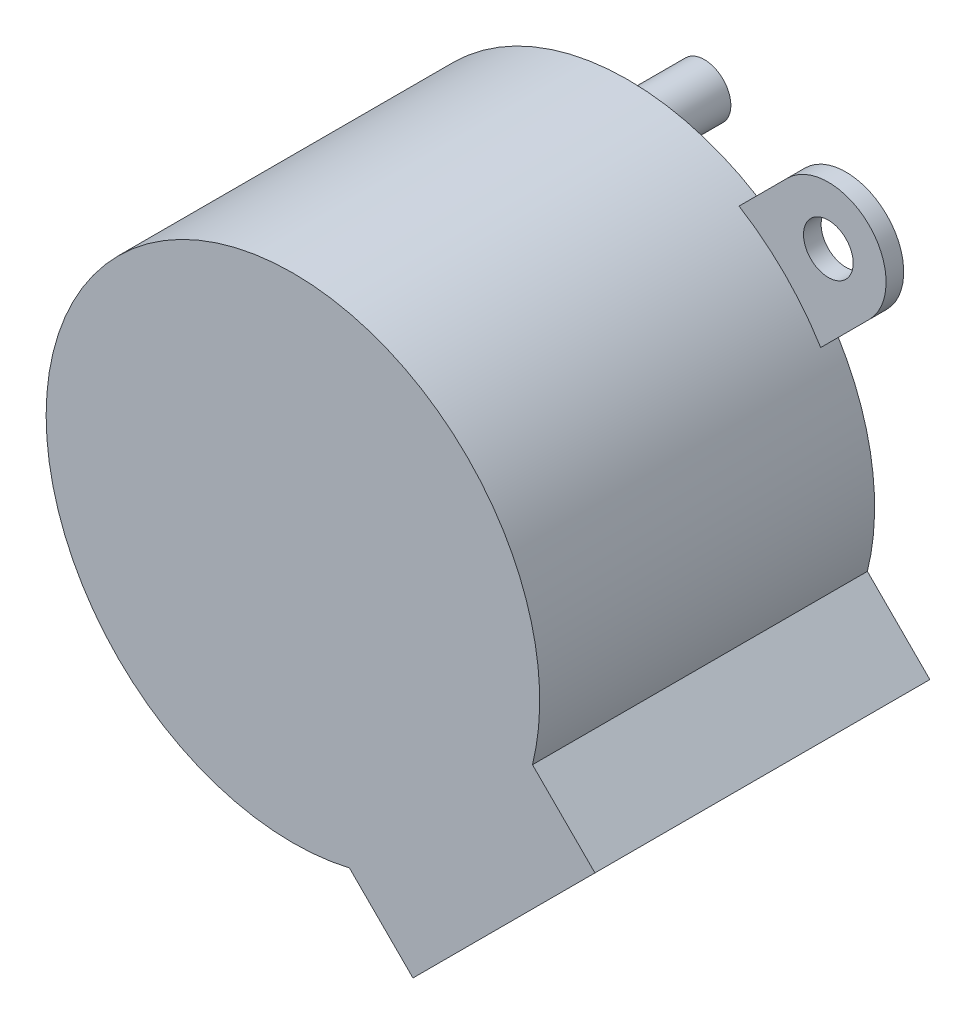
ISO-10303-21;
HEADER;
FILE_DESCRIPTION(('STEP AP214'),'2;1');
FILE_NAME('part.step','',(''),(''),'','','');
FILE_SCHEMA(('AUTOMOTIVE_DESIGN { 1 0 10303 214 1 1 1 1 }'));
ENDSEC;
DATA;
#1=APPLICATION_CONTEXT('core data for automotive mechanical design processes');
#2=APPLICATION_PROTOCOL_DEFINITION('international standard','automotive_design',2000,#1);
#3=PRODUCT_CONTEXT('',#1,'mechanical');
#4=PRODUCT('Part','Part','',(#3));
#5=PRODUCT_RELATED_PRODUCT_CATEGORY('part','',(#4));
#6=PRODUCT_DEFINITION_FORMATION('','',#4);
#7=PRODUCT_DEFINITION_CONTEXT('part definition',#1,'design');
#8=PRODUCT_DEFINITION('design','',#6,#7);
#9=PRODUCT_DEFINITION_SHAPE('','',#8);
#10=(LENGTH_UNIT() NAMED_UNIT(*) SI_UNIT(.MILLI.,.METRE.));
#11=(NAMED_UNIT(*) PLANE_ANGLE_UNIT() SI_UNIT($,.RADIAN.));
#12=(NAMED_UNIT(*) SI_UNIT($,.STERADIAN.) SOLID_ANGLE_UNIT());
#13=UNCERTAINTY_MEASURE_WITH_UNIT(LENGTH_MEASURE(1.E-05),#10,'distance_accuracy_value','');
#14=(GEOMETRIC_REPRESENTATION_CONTEXT(3) GLOBAL_UNCERTAINTY_ASSIGNED_CONTEXT((#13)) GLOBAL_UNIT_ASSIGNED_CONTEXT((#10,
#11,#12)) REPRESENTATION_CONTEXT('',''));
#15=CARTESIAN_POINT('',(0.,0.,0.));
#16=DIRECTION('',(0.,0.,1.));
#17=DIRECTION('',(1.,0.,0.));
#18=AXIS2_PLACEMENT_3D('',#15,#16,#17);
#19=CARTESIAN_POINT('',(39.0000952725,33.1973145386,13.0243098685));
#20=DIRECTION('',(0.,0.,1.));
#21=DIRECTION('',(1.,0.,0.));
#22=AXIS2_PLACEMENT_3D('',#19,#20,#21);
#23=PLANE('',#22);
#24=CARTESIAN_POINT('',(39.0000952725,33.1973145386,13.0243098685));
#25=DIRECTION('',(0.,0.,1.));
#26=DIRECTION('',(1.,0.,0.));
#27=AXIS2_PLACEMENT_3D('',#24,#25,#26);
#28=CIRCLE('',#27,1.5);
#29=CARTESIAN_POINT('',(37.9394351007,34.2579747104,13.0243098685));
#30=VERTEX_POINT('',#29);
#31=CARTESIAN_POINT('',(40.0607554443,32.1366543669,13.0243098685));
#32=VERTEX_POINT('',#31);
#33=EDGE_CURVE('E11',#30,#32,#28,.T.);
#34=ORIENTED_EDGE('',*,*,#33,.F.);
#35=CARTESIAN_POINT('',(39.0000952725,33.1973145386,13.0243098685));
#36=DIRECTION('',(0.,0.,1.));
#37=DIRECTION('',(1.,0.,0.));
#38=AXIS2_PLACEMENT_3D('',#35,#36,#37);
#39=CIRCLE('',#38,1.5);
#40=EDGE_CURVE('E235',#32,#30,#39,.T.);
#41=ORIENTED_EDGE('',*,*,#40,.F.);
#42=EDGE_LOOP('',(#34,#41));
#43=FACE_BOUND('',#42,.T.);
#44=ADVANCED_FACE('F51',(#43),#23,.F.);
#45=CARTESIAN_POINT('',(39.0000952725,33.1973145386,18.0243098685));
#46=DIRECTION('',(0.,0.,1.));
#47=DIRECTION('',(0.707106781186548,-0.707106781186548,0.));
#48=AXIS2_PLACEMENT_3D('',#45,#46,#47);
#49=CYLINDRICAL_SURFACE('',#48,1.5);
#50=DIRECTION('',(0.,0.,1.));
#51=VECTOR('',#50,1.);
#52=CARTESIAN_POINT('',(37.9394351007,34.2579747104,18.0243098685));
#53=LINE('',#52,#51);
#54=CARTESIAN_POINT('',(37.9394351007,34.2579747104,23.0243098685));
#55=VERTEX_POINT('',#54);
#56=EDGE_CURVE('E59',#30,#55,#53,.T.);
#57=ORIENTED_EDGE('',*,*,#56,.F.);
#58=ORIENTED_EDGE('',*,*,#33,.T.);
#59=DIRECTION('',(0.,0.,1.));
#60=VECTOR('',#59,1.);
#61=CARTESIAN_POINT('',(40.0607554443,32.1366543669,18.0243098685));
#62=LINE('',#61,#60);
#63=CARTESIAN_POINT('',(40.0607554443,32.1366543669,23.0243098685));
#64=VERTEX_POINT('',#63);
#65=EDGE_CURVE('E234',#32,#64,#62,.T.);
#66=ORIENTED_EDGE('',*,*,#65,.T.);
#67=CARTESIAN_POINT('',(39.0000952725,33.1973145386,23.0243098685));
#68=DIRECTION('',(0.,0.,1.));
#69=DIRECTION('',(1.,0.,0.));
#70=AXIS2_PLACEMENT_3D('',#67,#68,#69);
#71=CIRCLE('',#70,1.5);
#72=EDGE_CURVE('E251',#55,#64,#71,.T.);
#73=ORIENTED_EDGE('',*,*,#72,.F.);
#74=EDGE_LOOP('',(#57,#58,#66,#73));
#75=FACE_BOUND('',#74,.T.);
#76=ADVANCED_FACE('F255',(#75),#49,.T.);
#77=CARTESIAN_POINT('',(39.0000952725,33.1973145386,18.0243098685));
#78=DIRECTION('',(0.,0.,1.));
#79=DIRECTION('',(0.707106781186548,-0.707106781186548,0.));
#80=AXIS2_PLACEMENT_3D('',#77,#78,#79);
#81=CYLINDRICAL_SURFACE('',#80,1.5);
#82=ORIENTED_EDGE('',*,*,#65,.F.);
#83=ORIENTED_EDGE('',*,*,#40,.T.);
#84=ORIENTED_EDGE('',*,*,#56,.T.);
#85=CARTESIAN_POINT('',(39.0000952725,33.1973145386,23.0243098685));
#86=DIRECTION('',(0.,0.,1.));
#87=DIRECTION('',(1.,0.,0.));
#88=AXIS2_PLACEMENT_3D('',#85,#86,#87);
#89=CIRCLE('',#88,1.5);
#90=EDGE_CURVE('E245',#64,#55,#89,.T.);
#91=ORIENTED_EDGE('',*,*,#90,.F.);
#92=EDGE_LOOP('',(#82,#83,#84,#91));
#93=FACE_BOUND('',#92,.T.);
#94=ADVANCED_FACE('F244',(#93),#81,.T.);
#95=CARTESIAN_POINT('',(57.0313181928,39.9148289599,23.5243098685));
#96=DIRECTION('',(0.,0.,1.));
#97=DIRECTION('',(0.707106781186548,-0.707106781186548,0.));
#98=AXIS2_PLACEMENT_3D('',#95,#96,#97);
#99=CYLINDRICAL_SURFACE('',#98,1.40948287933);
#100=DIRECTION('',(0.,0.,-1.));
#101=VECTOR('',#100,1.);
#102=CARTESIAN_POINT('',(58.0279730947,38.918174058,23.5243098685));
#103=LINE('',#102,#101);
#104=CARTESIAN_POINT('',(58.0279730947,38.918174058,24.0243098685));
#105=VERTEX_POINT('',#104);
#106=CARTESIAN_POINT('',(58.0279730947,38.918174058,23.0243098685));
#107=VERTEX_POINT('',#106);
#108=EDGE_CURVE('E210',#105,#107,#103,.T.);
#109=ORIENTED_EDGE('',*,*,#108,.F.);
#110=CARTESIAN_POINT('',(57.0313181928,39.9148289599,24.0243098685));
#111=DIRECTION('',(0.,0.,1.));
#112=DIRECTION('',(1.,0.,0.));
#113=AXIS2_PLACEMENT_3D('',#110,#111,#112);
#114=CIRCLE('',#113,1.40948287933);
#115=CARTESIAN_POINT('',(56.0346632908,40.9114838619,24.0243098685));
#116=VERTEX_POINT('',#115);
#117=EDGE_CURVE('E214',#105,#116,#114,.T.);
#118=ORIENTED_EDGE('',*,*,#117,.T.);
#119=DIRECTION('',(0.,0.,-1.));
#120=VECTOR('',#119,1.);
#121=CARTESIAN_POINT('',(56.0346632908,40.9114838619,23.5243098685));
#122=LINE('',#121,#120);
#123=CARTESIAN_POINT('',(56.0346632908,40.9114838619,23.0243098685));
#124=VERTEX_POINT('',#123);
#125=EDGE_CURVE('E199',#116,#124,#122,.T.);
#126=ORIENTED_EDGE('',*,*,#125,.T.);
#127=CARTESIAN_POINT('',(57.0313181928,39.9148289599,23.0243098685));
#128=DIRECTION('',(0.,0.,1.));
#129=DIRECTION('',(1.,0.,0.));
#130=AXIS2_PLACEMENT_3D('',#127,#128,#129);
#131=CIRCLE('',#130,1.40948287933);
#132=EDGE_CURVE('E312',#107,#124,#131,.T.);
#133=ORIENTED_EDGE('',*,*,#132,.F.);
#134=EDGE_LOOP('',(#109,#118,#126,#133));
#135=FACE_BOUND('',#134,.T.);
#136=ADVANCED_FACE('F215',(#135),#99,.F.);
#137=CARTESIAN_POINT('',(57.0313181928,39.9148289599,23.5243098685));
#138=DIRECTION('',(0.,0.,1.));
#139=DIRECTION('',(0.707106781186548,-0.707106781186548,0.));
#140=AXIS2_PLACEMENT_3D('',#137,#138,#139);
#141=CYLINDRICAL_SURFACE('',#140,1.40948287933);
#142=ORIENTED_EDGE('',*,*,#125,.F.);
#143=CARTESIAN_POINT('',(57.0313181928,39.9148289599,24.0243098685));
#144=DIRECTION('',(0.,0.,1.));
#145=DIRECTION('',(1.,0.,0.));
#146=AXIS2_PLACEMENT_3D('',#143,#144,#145);
#147=CIRCLE('',#146,1.40948287933);
#148=EDGE_CURVE('E203',#116,#105,#147,.T.);
#149=ORIENTED_EDGE('',*,*,#148,.T.);
#150=ORIENTED_EDGE('',*,*,#108,.T.);
#151=CARTESIAN_POINT('',(57.0313181928,39.9148289599,23.0243098685));
#152=DIRECTION('',(0.,0.,1.));
#153=DIRECTION('',(1.,0.,0.));
#154=AXIS2_PLACEMENT_3D('',#151,#152,#153);
#155=CIRCLE('',#154,1.40948287933);
#156=EDGE_CURVE('E205',#124,#107,#155,.T.);
#157=ORIENTED_EDGE('',*,*,#156,.F.);
#158=EDGE_LOOP('',(#142,#149,#150,#157));
#159=FACE_BOUND('',#158,.T.);
#160=ADVANCED_FACE('F201',(#159),#141,.F.);
#161=CARTESIAN_POINT('',(54.7147903766,42.2313567761,23.0243098685));
#162=DIRECTION('',(0.707106781186548,-0.707106781186548,0.));
#163=DIRECTION('',(0.,0.,-1.));
#164=AXIS2_PLACEMENT_3D('',#161,#162,#163);
#165=PLANE('',#164);
#166=DIRECTION('',(-0.707106781186548,-0.707106781186548,0.));
#167=VECTOR('',#166,1.);
#168=CARTESIAN_POINT('',(53.3399261386,40.856492538,23.0243098685));
#169=LINE('',#168,#167);
#170=CARTESIAN_POINT('',(54.7147903766,42.2313567761,23.0243098685));
#171=VERTEX_POINT('',#170);
#172=CARTESIAN_POINT('',(51.9650619005,39.4816283,23.0243098685));
#173=VERTEX_POINT('',#172);
#174=EDGE_CURVE('E430',#171,#173,#169,.T.);
#175=ORIENTED_EDGE('',*,*,#174,.T.);
#176=DIRECTION('',(0.,0.,-1.));
#177=VECTOR('',#176,1.);
#178=CARTESIAN_POINT('',(51.9650619005,39.4816283,33.0243098685));
#179=LINE('',#178,#177);
#180=CARTESIAN_POINT('',(51.9650619005,39.4816283,24.0243098685));
#181=VERTEX_POINT('',#180);
#182=EDGE_CURVE('E346',#181,#173,#179,.T.);
#183=ORIENTED_EDGE('',*,*,#182,.F.);
#184=DIRECTION('',(-0.707106781186548,-0.707106781186548,0.));
#185=VECTOR('',#184,1.);
#186=CARTESIAN_POINT('',(53.3399261386,40.856492538,24.0243098685));
#187=LINE('',#186,#185);
#188=CARTESIAN_POINT('',(54.7147903766,42.2313567761,24.0243098685));
#189=VERTEX_POINT('',#188);
#190=EDGE_CURVE('E222',#189,#181,#187,.T.);
#191=ORIENTED_EDGE('',*,*,#190,.F.);
#192=DIRECTION('',(0.,0.,-1.));
#193=VECTOR('',#192,1.);
#194=CARTESIAN_POINT('',(54.7147903766,42.2313567761,23.5243098685));
#195=LINE('',#194,#193);
#196=EDGE_CURVE('E211',#189,#171,#195,.T.);
#197=ORIENTED_EDGE('',*,*,#196,.T.);
#198=EDGE_LOOP('',(#175,#183,#191,#197));
#199=FACE_BOUND('',#198,.T.);
#200=ADVANCED_FACE('F544',(#199),#165,.F.);
#201=CARTESIAN_POINT('',(57.0313181928,39.9148289599,23.5243098685));
#202=DIRECTION('',(0.,0.,1.));
#203=DIRECTION('',(0.707106781186548,-0.707106781186548,0.));
#204=AXIS2_PLACEMENT_3D('',#201,#202,#203);
#205=CYLINDRICAL_SURFACE('',#204,3.27606505521);
#206=CARTESIAN_POINT('',(57.0313181928,39.9148289599,23.0243098685));
#207=DIRECTION('',(0.,0.,1.));
#208=DIRECTION('',(1.,0.,0.));
#209=AXIS2_PLACEMENT_3D('',#206,#207,#208);
#210=CIRCLE('',#209,3.27606505521);
#211=CARTESIAN_POINT('',(59.3478460089,37.5983011438,23.0243098685));
#212=VERTEX_POINT('',#211);
#213=EDGE_CURVE('E434',#212,#171,#210,.T.);
#214=ORIENTED_EDGE('',*,*,#213,.T.);
#215=ORIENTED_EDGE('',*,*,#196,.F.);
#216=CARTESIAN_POINT('',(57.0313181928,39.9148289599,24.0243098685));
#217=DIRECTION('',(0.,0.,1.));
#218=DIRECTION('',(1.,0.,0.));
#219=AXIS2_PLACEMENT_3D('',#216,#217,#218);
#220=CIRCLE('',#219,3.27606505521);
#221=CARTESIAN_POINT('',(59.3478460089,37.5983011438,24.0243098685));
#222=VERTEX_POINT('',#221);
#223=EDGE_CURVE('E227',#222,#189,#220,.T.);
#224=ORIENTED_EDGE('',*,*,#223,.F.);
#225=DIRECTION('',(0.,0.,-1.));
#226=VECTOR('',#225,1.);
#227=CARTESIAN_POINT('',(59.3478460089,37.5983011438,23.5243098685));
#228=LINE('',#227,#226);
#229=EDGE_CURVE('E408',#222,#212,#228,.T.);
#230=ORIENTED_EDGE('',*,*,#229,.T.);
#231=EDGE_LOOP('',(#214,#215,#224,#230));
#232=FACE_BOUND('',#231,.T.);
#233=ADVANCED_FACE('F548',(#232),#205,.T.);
#234=CARTESIAN_POINT('',(39.0000952725,33.1973145386,24.0243098685));
#235=DIRECTION('',(0.,0.,1.));
#236=DIRECTION('',(1.,0.,0.));
#237=AXIS2_PLACEMENT_3D('',#234,#235,#236);
#238=PLANE('',#237);
#239=ORIENTED_EDGE('',*,*,#148,.F.);
#240=ORIENTED_EDGE('',*,*,#117,.F.);
#241=EDGE_LOOP('',(#239,#240));
#242=FACE_BOUND('',#241,.T.);
#243=DIRECTION('',(0.707106781186548,0.707106781186548,0.));
#244=VECTOR('',#243,1.);
#245=CARTESIAN_POINT('',(57.9729817709,36.2234369057,24.0243098685));
#246=LINE('',#245,#244);
#247=CARTESIAN_POINT('',(56.5981175328,34.8485726677,24.0243098685));
#248=VERTEX_POINT('',#247);
#249=EDGE_CURVE('E411',#248,#222,#246,.T.);
#250=ORIENTED_EDGE('',*,*,#249,.T.);
#251=ORIENTED_EDGE('',*,*,#223,.T.);
#252=ORIENTED_EDGE('',*,*,#190,.T.);
#253=CARTESIAN_POINT('',(44.656949522,27.5404602892,24.0243098685));
#254=DIRECTION('',(0.,0.,1.));
#255=DIRECTION('',(1.,0.,0.));
#256=AXIS2_PLACEMENT_3D('',#253,#254,#255);
#257=CIRCLE('',#256,14.);
#258=EDGE_CURVE('E351',#248,#181,#257,.T.);
#259=ORIENTED_EDGE('',*,*,#258,.F.);
#260=EDGE_LOOP('',(#250,#251,#252,#259));
#261=FACE_BOUND('',#260,.T.);
#262=ADVANCED_FACE('F219',(#242,#261),#238,.T.);
#263=CARTESIAN_POINT('',(56.5981175328,34.8485726677,23.0243098685));
#264=DIRECTION('',(-0.707106781186548,0.707106781186548,0.));
#265=DIRECTION('',(0.,0.,1.));
#266=AXIS2_PLACEMENT_3D('',#263,#264,#265);
#267=PLANE('',#266);
#268=DIRECTION('',(0.707106781186548,0.707106781186548,0.));
#269=VECTOR('',#268,1.);
#270=CARTESIAN_POINT('',(57.9729817709,36.2234369057,23.0243098685));
#271=LINE('',#270,#269);
#272=CARTESIAN_POINT('',(56.5981175328,34.8485726677,23.0243098685));
#273=VERTEX_POINT('',#272);
#274=EDGE_CURVE('E440',#273,#212,#271,.T.);
#275=ORIENTED_EDGE('',*,*,#274,.T.);
#276=ORIENTED_EDGE('',*,*,#229,.F.);
#277=ORIENTED_EDGE('',*,*,#249,.F.);
#278=DIRECTION('',(0.,0.,-1.));
#279=VECTOR('',#278,1.);
#280=CARTESIAN_POINT('',(56.5981175328,34.8485726677,33.0243098685));
#281=LINE('',#280,#279);
#282=EDGE_CURVE('E284',#248,#273,#281,.T.);
#283=ORIENTED_EDGE('',*,*,#282,.T.);
#284=EDGE_LOOP('',(#275,#276,#277,#283));
#285=FACE_BOUND('',#284,.T.);
#286=ADVANCED_FACE('F465',(#285),#267,.F.);
#287=CARTESIAN_POINT('',(39.0000952725,33.1973145386,24.0243098685));
#288=DIRECTION('',(0.,0.,1.));
#289=DIRECTION('',(1.,0.,0.));
#290=AXIS2_PLACEMENT_3D('',#287,#288,#289);
#291=PLANE('',#290);
#292=CARTESIAN_POINT('',(32.2825808512,15.1660916184,24.0243098685));
#293=DIRECTION('',(0.,0.,1.));
#294=DIRECTION('',(1.,0.,0.));
#295=AXIS2_PLACEMENT_3D('',#292,#293,#294);
#296=CIRCLE('',#295,1.40948287933);
#297=CARTESIAN_POINT('',(31.2859259493,16.1627465203,24.0243098685));
#298=VERTEX_POINT('',#297);
#299=CARTESIAN_POINT('',(33.2792357532,14.1694367165,24.0243098685));
#300=VERTEX_POINT('',#299);
#301=EDGE_CURVE('E399',#298,#300,#296,.T.);
#302=ORIENTED_EDGE('',*,*,#301,.F.);
#303=CARTESIAN_POINT('',(32.2825808512,15.1660916184,24.0243098685));
#304=DIRECTION('',(0.,0.,1.));
#305=DIRECTION('',(1.,0.,0.));
#306=AXIS2_PLACEMENT_3D('',#303,#304,#305);
#307=CIRCLE('',#306,1.40948287933);
#308=EDGE_CURVE('E406',#300,#298,#307,.T.);
#309=ORIENTED_EDGE('',*,*,#308,.F.);
#310=EDGE_LOOP('',(#302,#309));
#311=FACE_BOUND('',#310,.T.);
#312=DIRECTION('',(-0.707106781186548,-0.707106781186548,0.));
#313=VECTOR('',#312,1.);
#314=CARTESIAN_POINT('',(31.3409172731,18.8574836726,24.0243098685));
#315=LINE('',#314,#313);
#316=CARTESIAN_POINT('',(32.7157815112,20.2323479106,24.0243098685));
#317=VERTEX_POINT('',#316);
#318=CARTESIAN_POINT('',(29.9660530351,17.4826194345,24.0243098685));
#319=VERTEX_POINT('',#318);
#320=EDGE_CURVE('E381',#317,#319,#315,.T.);
#321=ORIENTED_EDGE('',*,*,#320,.T.);
#322=CARTESIAN_POINT('',(32.2825808512,15.1660916184,24.0243098685));
#323=DIRECTION('',(0.,0.,1.));
#324=DIRECTION('',(1.,0.,0.));
#325=AXIS2_PLACEMENT_3D('',#322,#323,#324);
#326=CIRCLE('',#325,3.27606505521);
#327=CARTESIAN_POINT('',(34.5991086674,12.8495638022,24.0243098685));
#328=VERTEX_POINT('',#327);
#329=EDGE_CURVE('E389',#319,#328,#326,.T.);
#330=ORIENTED_EDGE('',*,*,#329,.T.);
#331=DIRECTION('',(0.707106781186548,0.707106781186548,0.));
#332=VECTOR('',#331,1.);
#333=CARTESIAN_POINT('',(35.9739729054,14.2244280403,24.0243098685));
#334=LINE('',#333,#332);
#335=CARTESIAN_POINT('',(37.3488371435,15.5992922783,24.0243098685));
#336=VERTEX_POINT('',#335);
#337=EDGE_CURVE('E393',#328,#336,#334,.T.);
#338=ORIENTED_EDGE('',*,*,#337,.T.);
#339=CARTESIAN_POINT('',(44.656949522,27.5404602892,24.0243098685));
#340=DIRECTION('',(0.,0.,1.));
#341=DIRECTION('',(1.,0.,0.));
#342=AXIS2_PLACEMENT_3D('',#339,#340,#341);
#343=CIRCLE('',#342,14.);
#344=EDGE_CURVE('E285',#317,#336,#343,.T.);
#345=ORIENTED_EDGE('',*,*,#344,.F.);
#346=EDGE_LOOP('',(#321,#330,#338,#345));
#347=FACE_BOUND('',#346,.T.);
#348=ADVANCED_FACE('F493',(#311,#347),#291,.T.);
#349=CARTESIAN_POINT('',(32.2825808512,15.1660916184,23.5243098685));
#350=DIRECTION('',(0.,0.,1.));
#351=DIRECTION('',(0.707106781186548,-0.707106781186548,0.));
#352=AXIS2_PLACEMENT_3D('',#349,#350,#351);
#353=CYLINDRICAL_SURFACE('',#352,1.40948287933);
#354=DIRECTION('',(0.,0.,-1.));
#355=VECTOR('',#354,1.);
#356=CARTESIAN_POINT('',(33.2792357532,14.1694367165,23.5243098685));
#357=LINE('',#356,#355);
#358=CARTESIAN_POINT('',(33.2792357532,14.1694367165,23.0243098685));
#359=VERTEX_POINT('',#358);
#360=EDGE_CURVE('E403',#300,#359,#357,.T.);
#361=ORIENTED_EDGE('',*,*,#360,.F.);
#362=ORIENTED_EDGE('',*,*,#308,.T.);
#363=DIRECTION('',(0.,0.,-1.));
#364=VECTOR('',#363,1.);
#365=CARTESIAN_POINT('',(31.2859259493,16.1627465203,23.5243098685));
#366=LINE('',#365,#364);
#367=CARTESIAN_POINT('',(31.2859259493,16.1627465203,23.0243098685));
#368=VERTEX_POINT('',#367);
#369=EDGE_CURVE('E396',#298,#368,#366,.T.);
#370=ORIENTED_EDGE('',*,*,#369,.T.);
#371=CARTESIAN_POINT('',(32.2825808512,15.1660916184,23.0243098685));
#372=DIRECTION('',(0.,0.,1.));
#373=DIRECTION('',(1.,0.,0.));
#374=AXIS2_PLACEMENT_3D('',#371,#372,#373);
#375=CIRCLE('',#374,1.40948287933);
#376=EDGE_CURVE('E306',#359,#368,#375,.T.);
#377=ORIENTED_EDGE('',*,*,#376,.F.);
#378=EDGE_LOOP('',(#361,#362,#370,#377));
#379=FACE_BOUND('',#378,.T.);
#380=ADVANCED_FACE('F565',(#379),#353,.F.);
#381=CARTESIAN_POINT('',(32.2825808512,15.1660916184,23.5243098685));
#382=DIRECTION('',(0.,0.,1.));
#383=DIRECTION('',(0.707106781186548,-0.707106781186548,0.));
#384=AXIS2_PLACEMENT_3D('',#381,#382,#383);
#385=CYLINDRICAL_SURFACE('',#384,1.40948287933);
#386=ORIENTED_EDGE('',*,*,#369,.F.);
#387=ORIENTED_EDGE('',*,*,#301,.T.);
#388=ORIENTED_EDGE('',*,*,#360,.T.);
#389=CARTESIAN_POINT('',(32.2825808512,15.1660916184,23.0243098685));
#390=DIRECTION('',(0.,0.,1.));
#391=DIRECTION('',(1.,0.,0.));
#392=AXIS2_PLACEMENT_3D('',#389,#390,#391);
#393=CIRCLE('',#392,1.40948287933);
#394=EDGE_CURVE('E253',#368,#359,#393,.T.);
#395=ORIENTED_EDGE('',*,*,#394,.F.);
#396=EDGE_LOOP('',(#386,#387,#388,#395));
#397=FACE_BOUND('',#396,.T.);
#398=ADVANCED_FACE('F569',(#397),#385,.F.);
#399=CARTESIAN_POINT('',(56.5981175328,34.8485726677,23.0243098685));
#400=DIRECTION('',(-0.707106781186548,0.707106781186548,0.));
#401=DIRECTION('',(0.,0.,1.));
#402=AXIS2_PLACEMENT_3D('',#399,#400,#401);
#403=PLANE('',#402);
#404=DIRECTION('',(0.707106781186548,0.707106781186548,0.));
#405=VECTOR('',#404,1.);
#406=CARTESIAN_POINT('',(35.9739729054,14.2244280403,23.0243098685));
#407=LINE('',#406,#405);
#408=CARTESIAN_POINT('',(34.5991086674,12.8495638022,23.0243098685));
#409=VERTEX_POINT('',#408);
#410=CARTESIAN_POINT('',(37.3488371435,15.5992922783,23.0243098685));
#411=VERTEX_POINT('',#410);
#412=EDGE_CURVE('E276',#409,#411,#407,.T.);
#413=ORIENTED_EDGE('',*,*,#412,.T.);
#414=DIRECTION('',(0.,0.,-1.));
#415=VECTOR('',#414,1.);
#416=CARTESIAN_POINT('',(37.3488371435,15.5992922783,33.0243098685));
#417=LINE('',#416,#415);
#418=EDGE_CURVE('E280',#336,#411,#417,.T.);
#419=ORIENTED_EDGE('',*,*,#418,.F.);
#420=ORIENTED_EDGE('',*,*,#337,.F.);
#421=DIRECTION('',(0.,0.,-1.));
#422=VECTOR('',#421,1.);
#423=CARTESIAN_POINT('',(34.5991086674,12.8495638022,23.5243098685));
#424=LINE('',#423,#422);
#425=EDGE_CURVE('E385',#328,#409,#424,.T.);
#426=ORIENTED_EDGE('',*,*,#425,.T.);
#427=EDGE_LOOP('',(#413,#419,#420,#426));
#428=FACE_BOUND('',#427,.T.);
#429=ADVANCED_FACE('F508',(#428),#403,.F.);
#430=CARTESIAN_POINT('',(32.2825808512,15.1660916184,23.5243098685));
#431=DIRECTION('',(0.,0.,1.));
#432=DIRECTION('',(-0.707106781186548,0.707106781186548,0.));
#433=AXIS2_PLACEMENT_3D('',#430,#431,#432);
#434=CYLINDRICAL_SURFACE('',#433,3.27606505521);
#435=CARTESIAN_POINT('',(32.2825808512,15.1660916184,23.0243098685));
#436=DIRECTION('',(0.,0.,1.));
#437=DIRECTION('',(1.,0.,0.));
#438=AXIS2_PLACEMENT_3D('',#435,#436,#437);
#439=CIRCLE('',#438,3.27606505521);
#440=CARTESIAN_POINT('',(29.9660530351,17.4826194345,23.0243098685));
#441=VERTEX_POINT('',#440);
#442=EDGE_CURVE('E293',#441,#409,#439,.T.);
#443=ORIENTED_EDGE('',*,*,#442,.T.);
#444=ORIENTED_EDGE('',*,*,#425,.F.);
#445=ORIENTED_EDGE('',*,*,#329,.F.);
#446=DIRECTION('',(0.,0.,-1.));
#447=VECTOR('',#446,1.);
#448=CARTESIAN_POINT('',(29.9660530351,17.4826194345,23.5243098685));
#449=LINE('',#448,#447);
#450=EDGE_CURVE('E378',#319,#441,#449,.T.);
#451=ORIENTED_EDGE('',*,*,#450,.T.);
#452=EDGE_LOOP('',(#443,#444,#445,#451));
#453=FACE_BOUND('',#452,.T.);
#454=ADVANCED_FACE('F506',(#453),#434,.T.);
#455=CARTESIAN_POINT('',(54.7147903766,42.2313567761,23.0243098685));
#456=DIRECTION('',(0.707106781186548,-0.707106781186548,0.));
#457=DIRECTION('',(0.,0.,-1.));
#458=AXIS2_PLACEMENT_3D('',#455,#456,#457);
#459=PLANE('',#458);
#460=DIRECTION('',(-0.707106781186548,-0.707106781186548,0.));
#461=VECTOR('',#460,1.);
#462=CARTESIAN_POINT('',(31.3409172731,18.8574836726,23.0243098685));
#463=LINE('',#462,#461);
#464=CARTESIAN_POINT('',(32.7157815112,20.2323479106,23.0243098685));
#465=VERTEX_POINT('',#464);
#466=EDGE_CURVE('E289',#465,#441,#463,.T.);
#467=ORIENTED_EDGE('',*,*,#466,.T.);
#468=ORIENTED_EDGE('',*,*,#450,.F.);
#469=ORIENTED_EDGE('',*,*,#320,.F.);
#470=DIRECTION('',(0.,0.,-1.));
#471=VECTOR('',#470,1.);
#472=CARTESIAN_POINT('',(32.7157815112,20.2323479106,33.0243098685));
#473=LINE('',#472,#471);
#474=EDGE_CURVE('E355',#317,#465,#473,.T.);
#475=ORIENTED_EDGE('',*,*,#474,.T.);
#476=EDGE_LOOP('',(#467,#468,#469,#475));
#477=FACE_BOUND('',#476,.T.);
#478=ADVANCED_FACE('F490',(#477),#459,.F.);
#479=CARTESIAN_POINT('',(58.2468203794,24.1766216965,24.0243098685));
#480=DIRECTION('',(0.707106781186548,0.707106781186548,0.));
#481=DIRECTION('',(0.,0.,-1.));
#482=AXIS2_PLACEMENT_3D('',#479,#480,#481);
#483=PLANE('',#482);
#484=DIRECTION('',(-0.707106781186548,0.707106781186548,0.));
#485=VECTOR('',#484,1.);
#486=CARTESIAN_POINT('',(60.018800657,22.4046414189,23.0243098685));
#487=LINE('',#486,#485);
#488=CARTESIAN_POINT('',(61.7907809345,20.6326611414,23.0243098685));
#489=VERTEX_POINT('',#488);
#490=CARTESIAN_POINT('',(58.2468203794,24.1766216965,23.0243098685));
#491=VERTEX_POINT('',#490);
#492=EDGE_CURVE('E267',#489,#491,#487,.T.);
#493=ORIENTED_EDGE('',*,*,#492,.T.);
#494=DIRECTION('',(0.,0.,-1.));
#495=VECTOR('',#494,1.);
#496=CARTESIAN_POINT('',(58.2468203794,24.1766216965,33.0243098685));
#497=LINE('',#496,#495);
#498=CARTESIAN_POINT('',(58.2468203794,24.1766216965,42.0243098685));
#499=VERTEX_POINT('',#498);
#500=EDGE_CURVE('E350',#499,#491,#497,.T.);
#501=ORIENTED_EDGE('',*,*,#500,.F.);
#502=DIRECTION('',(-0.707106781186548,0.707106781186548,0.));
#503=VECTOR('',#502,1.);
#504=CARTESIAN_POINT('',(60.018800657,22.4046414189,42.0243098685));
#505=LINE('',#504,#503);
#506=CARTESIAN_POINT('',(61.7907809345,20.6326611414,42.0243098685));
#507=VERTEX_POINT('',#506);
#508=EDGE_CURVE('E330',#507,#499,#505,.T.);
#509=ORIENTED_EDGE('',*,*,#508,.F.);
#510=DIRECTION('',(0.,0.,-1.));
#511=VECTOR('',#510,1.);
#512=CARTESIAN_POINT('',(61.7907809345,20.6326611414,32.5243098685));
#513=LINE('',#512,#511);
#514=EDGE_CURVE('E373',#507,#489,#513,.T.);
#515=ORIENTED_EDGE('',*,*,#514,.T.);
#516=EDGE_LOOP('',(#493,#501,#509,#515));
#517=FACE_BOUND('',#516,.T.);
#518=ADVANCED_FACE('F617',(#517),#483,.T.);
#519=CARTESIAN_POINT('',(61.7907809345,20.6326611414,24.0243098685));
#520=DIRECTION('',(0.707106781186548,-0.707106781186548,0.));
#521=DIRECTION('',(0.,0.,-1.));
#522=AXIS2_PLACEMENT_3D('',#519,#520,#521);
#523=PLANE('',#522);
#524=DIRECTION('',(0.707106781186548,0.707106781186548,0.));
#525=VECTOR('',#524,1.);
#526=CARTESIAN_POINT('',(56.6289014319,15.4707816387,23.0243098685));
#527=LINE('',#526,#525);
#528=CARTESIAN_POINT('',(51.4670219292,10.308902136,23.0243098685));
#529=VERTEX_POINT('',#528);
#530=EDGE_CURVE('E270',#529,#489,#527,.T.);
#531=ORIENTED_EDGE('',*,*,#530,.T.);
#532=ORIENTED_EDGE('',*,*,#514,.F.);
#533=DIRECTION('',(0.707106781186548,0.707106781186548,0.));
#534=VECTOR('',#533,1.);
#535=CARTESIAN_POINT('',(56.6289014319,15.4707816387,42.0243098685));
#536=LINE('',#535,#534);
#537=CARTESIAN_POINT('',(51.4670219292,10.308902136,42.0243098685));
#538=VERTEX_POINT('',#537);
#539=EDGE_CURVE('E327',#538,#507,#536,.T.);
#540=ORIENTED_EDGE('',*,*,#539,.F.);
#541=DIRECTION('',(0.,0.,-1.));
#542=VECTOR('',#541,1.);
#543=CARTESIAN_POINT('',(51.4670219292,10.308902136,32.5243098685));
#544=LINE('',#543,#542);
#545=EDGE_CURVE('E370',#538,#529,#544,.T.);
#546=ORIENTED_EDGE('',*,*,#545,.T.);
#547=EDGE_LOOP('',(#531,#532,#540,#546));
#548=FACE_BOUND('',#547,.T.);
#549=ADVANCED_FACE('F627',(#548),#523,.T.);
#550=CARTESIAN_POINT('',(51.4670219292,10.308902136,24.0243098685));
#551=DIRECTION('',(-0.707106781186548,-0.707106781186548,0.));
#552=DIRECTION('',(-0.707106781186548,0.707106781186548,0.));
#553=AXIS2_PLACEMENT_3D('',#550,#551,#552);
#554=PLANE('',#553);
#555=DIRECTION('',(0.707106781186548,-0.707106781186548,0.));
#556=VECTOR('',#555,1.);
#557=CARTESIAN_POINT('',(49.6651817031,12.1107423621,23.0243098685));
#558=LINE('',#557,#556);
#559=CARTESIAN_POINT('',(47.863341477,13.9125825883,23.0243098685));
#560=VERTEX_POINT('',#559);
#561=EDGE_CURVE('E277',#560,#529,#558,.T.);
#562=ORIENTED_EDGE('',*,*,#561,.T.);
#563=ORIENTED_EDGE('',*,*,#545,.F.);
#564=DIRECTION('',(0.707106781186548,-0.707106781186548,0.));
#565=VECTOR('',#564,1.);
#566=CARTESIAN_POINT('',(49.6651817031,12.1107423621,42.0243098685));
#567=LINE('',#566,#565);
#568=CARTESIAN_POINT('',(47.863341477,13.9125825883,42.0243098685));
#569=VERTEX_POINT('',#568);
#570=EDGE_CURVE('E323',#569,#538,#567,.T.);
#571=ORIENTED_EDGE('',*,*,#570,.F.);
#572=DIRECTION('',(0.,0.,-1.));
#573=VECTOR('',#572,1.);
#574=CARTESIAN_POINT('',(47.863341477,13.9125825883,33.0243098685));
#575=LINE('',#574,#573);
#576=EDGE_CURVE('E342',#569,#560,#575,.T.);
#577=ORIENTED_EDGE('',*,*,#576,.T.);
#578=EDGE_LOOP('',(#562,#563,#571,#577));
#579=FACE_BOUND('',#578,.T.);
#580=ADVANCED_FACE('F638',(#579),#554,.T.);
#581=CARTESIAN_POINT('',(44.656949522,27.5404602892,33.0243098685));
#582=DIRECTION('',(0.,0.,1.));
#583=DIRECTION('',(0.707106781186548,-0.707106781186548,0.));
#584=AXIS2_PLACEMENT_3D('',#581,#582,#583);
#585=CYLINDRICAL_SURFACE('',#584,14.);
#586=ORIENTED_EDGE('',*,*,#282,.F.);
#587=ORIENTED_EDGE('',*,*,#258,.T.);
#588=ORIENTED_EDGE('',*,*,#182,.T.);
#589=CARTESIAN_POINT('',(44.656949522,27.5404602892,23.0243098685));
#590=DIRECTION('',(0.,0.,1.));
#591=DIRECTION('',(1.,0.,0.));
#592=AXIS2_PLACEMENT_3D('',#589,#590,#591);
#593=CIRCLE('',#592,14.);
#594=CARTESIAN_POINT('',(34.7574545854,37.4399552258,23.0243098685));
#595=VERTEX_POINT('',#594);
#596=EDGE_CURVE('E257',#173,#595,#593,.T.);
#597=ORIENTED_EDGE('',*,*,#596,.T.);
#598=DIRECTION('',(0.,0.,-1.));
#599=VECTOR('',#598,1.);
#600=CARTESIAN_POINT('',(34.7574545854,37.4399552258,33.0243098685));
#601=LINE('',#600,#599);
#602=CARTESIAN_POINT('',(34.7574545854,37.4399552258,42.0243098685));
#603=VERTEX_POINT('',#602);
#604=EDGE_CURVE('E345',#603,#595,#601,.T.);
#605=ORIENTED_EDGE('',*,*,#604,.F.);
#606=CARTESIAN_POINT('',(44.656949522,27.5404602892,42.0243098685));
#607=DIRECTION('',(0.,0.,1.));
#608=DIRECTION('',(1.,0.,0.));
#609=AXIS2_PLACEMENT_3D('',#606,#607,#608);
#610=CIRCLE('',#609,14.);
#611=CARTESIAN_POINT('',(51.9650619005,39.4816283,42.0243098685));
#612=VERTEX_POINT('',#611);
#613=EDGE_CURVE('E313',#612,#603,#610,.T.);
#614=ORIENTED_EDGE('',*,*,#613,.F.);
#615=CARTESIAN_POINT('',(44.656949522,27.5404602892,42.0243098685));
#616=DIRECTION('',(0.,0.,1.));
#617=DIRECTION('',(1.,0.,0.));
#618=AXIS2_PLACEMENT_3D('',#615,#616,#617);
#619=CIRCLE('',#618,14.);
#620=CARTESIAN_POINT('',(56.5981175328,34.8485726677,42.0243098685));
#621=VERTEX_POINT('',#620);
#622=EDGE_CURVE('E339',#621,#612,#619,.T.);
#623=ORIENTED_EDGE('',*,*,#622,.F.);
#624=CARTESIAN_POINT('',(44.656949522,27.5404602892,42.0243098685));
#625=DIRECTION('',(0.,0.,1.));
#626=DIRECTION('',(1.,0.,0.));
#627=AXIS2_PLACEMENT_3D('',#624,#625,#626);
#628=CIRCLE('',#627,14.);
#629=EDGE_CURVE('E335',#499,#621,#628,.T.);
#630=ORIENTED_EDGE('',*,*,#629,.F.);
#631=ORIENTED_EDGE('',*,*,#500,.T.);
#632=CARTESIAN_POINT('',(44.656949522,27.5404602892,23.0243098685));
#633=DIRECTION('',(0.,0.,1.));
#634=DIRECTION('',(1.,0.,0.));
#635=AXIS2_PLACEMENT_3D('',#632,#633,#634);
#636=CIRCLE('',#635,14.);
#637=EDGE_CURVE('E271',#491,#273,#636,.T.);
#638=ORIENTED_EDGE('',*,*,#637,.T.);
#639=EDGE_LOOP('',(#586,#587,#588,#597,#605,#614,#623,#630,#631,#638));
#640=FACE_BOUND('',#639,.T.);
#641=ADVANCED_FACE('F456',(#640),#585,.T.);
#642=CARTESIAN_POINT('',(44.656949522,27.5404602892,33.0243098685));
#643=DIRECTION('',(0.,0.,1.));
#644=DIRECTION('',(0.707106781186548,-0.707106781186548,0.));
#645=AXIS2_PLACEMENT_3D('',#642,#643,#644);
#646=CYLINDRICAL_SURFACE('',#645,14.);
#647=CARTESIAN_POINT('',(44.656949522,27.5404602892,23.0243098685));
#648=DIRECTION('',(0.,0.,1.));
#649=DIRECTION('',(1.,0.,0.));
#650=AXIS2_PLACEMENT_3D('',#647,#648,#649);
#651=CIRCLE('',#650,14.);
#652=EDGE_CURVE('E272',#411,#560,#651,.T.);
#653=ORIENTED_EDGE('',*,*,#652,.T.);
#654=ORIENTED_EDGE('',*,*,#576,.F.);
#655=CARTESIAN_POINT('',(44.656949522,27.5404602892,42.0243098685));
#656=DIRECTION('',(0.,0.,1.));
#657=DIRECTION('',(1.,0.,0.));
#658=AXIS2_PLACEMENT_3D('',#655,#656,#657);
#659=CIRCLE('',#658,14.);
#660=CARTESIAN_POINT('',(37.3488371435,15.5992922783,42.0243098685));
#661=VERTEX_POINT('',#660);
#662=EDGE_CURVE('E298',#661,#569,#659,.T.);
#663=ORIENTED_EDGE('',*,*,#662,.F.);
#664=CARTESIAN_POINT('',(44.656949522,27.5404602892,42.0243098685));
#665=DIRECTION('',(0.,0.,1.));
#666=DIRECTION('',(1.,0.,0.));
#667=AXIS2_PLACEMENT_3D('',#664,#665,#666);
#668=CIRCLE('',#667,14.);
#669=CARTESIAN_POINT('',(32.7157815112,20.2323479106,42.0243098685));
#670=VERTEX_POINT('',#669);
#671=EDGE_CURVE('E294',#670,#661,#668,.T.);
#672=ORIENTED_EDGE('',*,*,#671,.F.);
#673=CARTESIAN_POINT('',(44.656949522,27.5404602892,42.0243098685));
#674=DIRECTION('',(0.,0.,1.));
#675=DIRECTION('',(1.,0.,0.));
#676=AXIS2_PLACEMENT_3D('',#673,#674,#675);
#677=CIRCLE('',#676,14.);
#678=EDGE_CURVE('E299',#603,#670,#677,.T.);
#679=ORIENTED_EDGE('',*,*,#678,.F.);
#680=ORIENTED_EDGE('',*,*,#604,.T.);
#681=CARTESIAN_POINT('',(44.656949522,27.5404602892,23.0243098685));
#682=DIRECTION('',(0.,0.,1.));
#683=DIRECTION('',(1.,0.,0.));
#684=AXIS2_PLACEMENT_3D('',#681,#682,#683);
#685=CIRCLE('',#684,14.);
#686=EDGE_CURVE('E263',#595,#465,#685,.T.);
#687=ORIENTED_EDGE('',*,*,#686,.T.);
#688=ORIENTED_EDGE('',*,*,#474,.F.);
#689=ORIENTED_EDGE('',*,*,#344,.T.);
#690=ORIENTED_EDGE('',*,*,#418,.T.);
#691=EDGE_LOOP('',(#653,#654,#663,#672,#679,#680,#687,#688,#689,#690));
#692=FACE_BOUND('',#691,.T.);
#693=ADVANCED_FACE('F496',(#692),#646,.T.);
#694=CARTESIAN_POINT('',(39.0000952725,33.1973145386,42.0243098685));
#695=DIRECTION('',(0.,0.,1.));
#696=DIRECTION('',(1.,0.,0.));
#697=AXIS2_PLACEMENT_3D('',#694,#695,#696);
#698=PLANE('',#697);
#699=ORIENTED_EDGE('',*,*,#613,.T.);
#700=ORIENTED_EDGE('',*,*,#678,.T.);
#701=ORIENTED_EDGE('',*,*,#671,.T.);
#702=ORIENTED_EDGE('',*,*,#662,.T.);
#703=ORIENTED_EDGE('',*,*,#570,.T.);
#704=ORIENTED_EDGE('',*,*,#539,.T.);
#705=ORIENTED_EDGE('',*,*,#508,.T.);
#706=ORIENTED_EDGE('',*,*,#629,.T.);
#707=ORIENTED_EDGE('',*,*,#622,.T.);
#708=EDGE_LOOP('',(#699,#700,#701,#702,#703,#704,#705,#706,#707));
#709=FACE_BOUND('',#708,.T.);
#710=ADVANCED_FACE('F693',(#709),#698,.T.);
#711=CARTESIAN_POINT('',(39.0000952725,33.1973145386,23.0243098685));
#712=DIRECTION('',(0.,0.,1.));
#713=DIRECTION('',(1.,0.,0.));
#714=AXIS2_PLACEMENT_3D('',#711,#712,#713);
#715=PLANE('',#714);
#716=ORIENTED_EDGE('',*,*,#156,.T.);
#717=ORIENTED_EDGE('',*,*,#132,.T.);
#718=EDGE_LOOP('',(#716,#717));
#719=FACE_BOUND('',#718,.T.);
#720=ORIENTED_EDGE('',*,*,#394,.T.);
#721=ORIENTED_EDGE('',*,*,#376,.T.);
#722=EDGE_LOOP('',(#720,#721));
#723=FACE_BOUND('',#722,.T.);
#724=ORIENTED_EDGE('',*,*,#72,.T.);
#725=ORIENTED_EDGE('',*,*,#90,.T.);
#726=EDGE_LOOP('',(#724,#725));
#727=FACE_BOUND('',#726,.T.);
#728=ORIENTED_EDGE('',*,*,#174,.F.);
#729=ORIENTED_EDGE('',*,*,#213,.F.);
#730=ORIENTED_EDGE('',*,*,#274,.F.);
#731=ORIENTED_EDGE('',*,*,#637,.F.);
#732=ORIENTED_EDGE('',*,*,#492,.F.);
#733=ORIENTED_EDGE('',*,*,#530,.F.);
#734=ORIENTED_EDGE('',*,*,#561,.F.);
#735=ORIENTED_EDGE('',*,*,#652,.F.);
#736=ORIENTED_EDGE('',*,*,#412,.F.);
#737=ORIENTED_EDGE('',*,*,#442,.F.);
#738=ORIENTED_EDGE('',*,*,#466,.F.);
#739=ORIENTED_EDGE('',*,*,#686,.F.);
#740=ORIENTED_EDGE('',*,*,#596,.F.);
#741=EDGE_LOOP('',(#728,#729,#730,#731,#732,#733,#734,#735,#736,#737,#738,#739,#740));
#742=FACE_BOUND('',#741,.T.);
#743=ADVANCED_FACE('F249',(#719,#723,#727,#742),#715,.F.);
#744=CLOSED_SHELL('',(#44,#76,#94,#136,#160,#200,#233,#262,#286,#348,#380,#398,#429,#454,#478,
#518,#549,#580,#641,#693,#710,#743));
#745=MANIFOLD_SOLID_BREP('B2',#744);
#746=ADVANCED_BREP_SHAPE_REPRESENTATION('',(#18,#745),#14);
#747=SHAPE_DEFINITION_REPRESENTATION(#9,#746);
ENDSEC;
END-ISO-10303-21;
